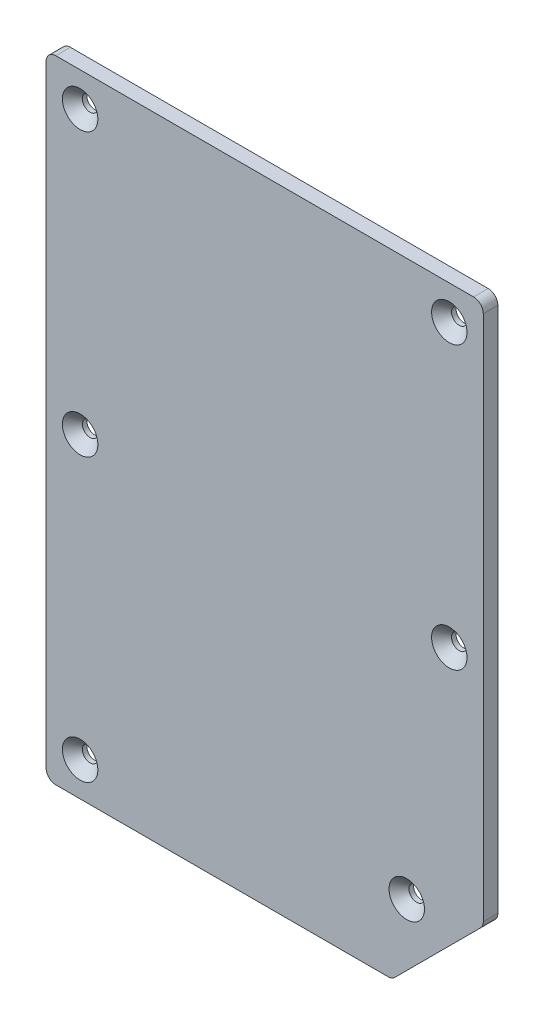
ISO-10303-21;
HEADER;
FILE_DESCRIPTION(('STEP AP214'),'2;1');
FILE_NAME('part.step','',(''),(''),'','','');
FILE_SCHEMA(('AUTOMOTIVE_DESIGN { 1 0 10303 214 1 1 1 1 }'));
ENDSEC;
DATA;
#1=APPLICATION_CONTEXT('core data for automotive mechanical design processes');
#2=APPLICATION_PROTOCOL_DEFINITION('international standard','automotive_design',2000,#1);
#3=PRODUCT_CONTEXT('',#1,'mechanical');
#4=PRODUCT('Part','Part','',(#3));
#5=PRODUCT_RELATED_PRODUCT_CATEGORY('part','',(#4));
#6=PRODUCT_DEFINITION_FORMATION('','',#4);
#7=PRODUCT_DEFINITION_CONTEXT('part definition',#1,'design');
#8=PRODUCT_DEFINITION('design','',#6,#7);
#9=PRODUCT_DEFINITION_SHAPE('','',#8);
#10=(LENGTH_UNIT() NAMED_UNIT(*) SI_UNIT(.MILLI.,.METRE.));
#11=(NAMED_UNIT(*) PLANE_ANGLE_UNIT() SI_UNIT($,.RADIAN.));
#12=(NAMED_UNIT(*) SI_UNIT($,.STERADIAN.) SOLID_ANGLE_UNIT());
#13=UNCERTAINTY_MEASURE_WITH_UNIT(LENGTH_MEASURE(1.E-05),#10,'distance_accuracy_value','');
#14=(GEOMETRIC_REPRESENTATION_CONTEXT(3) GLOBAL_UNCERTAINTY_ASSIGNED_CONTEXT((#13)) GLOBAL_UNIT_ASSIGNED_CONTEXT((#10,
#11,#12)) REPRESENTATION_CONTEXT('',''));
#15=CARTESIAN_POINT('',(0.,0.,0.));
#16=DIRECTION('',(0.,0.,1.));
#17=DIRECTION('',(1.,0.,0.));
#18=AXIS2_PLACEMENT_3D('',#15,#16,#17);
#19=CARTESIAN_POINT('',(43.,-40.3847763108502,3.));
#20=DIRECTION('',(0.,0.,-1.));
#21=DIRECTION('',(-1.,0.,0.));
#22=AXIS2_PLACEMENT_3D('',#19,#20,#21);
#23=CYLINDRICAL_SURFACE('',#22,2.00000000000002);
#24=CARTESIAN_POINT('',(43.,-40.3847763108502,0.));
#25=DIRECTION('',(0.,0.,1.));
#26=DIRECTION('',(-1.,0.,0.));
#27=AXIS2_PLACEMENT_3D('',#24,#25,#26);
#28=CIRCLE('',#27,2.00000000000002);
#29=CARTESIAN_POINT('',(44.4142135623731,-41.7989898732233,0.));
#30=VERTEX_POINT('',#29);
#31=CARTESIAN_POINT('',(45.,-40.3847763108502,0.));
#32=VERTEX_POINT('',#31);
#33=EDGE_CURVE('E143',#30,#32,#28,.T.);
#34=ORIENTED_EDGE('',*,*,#33,.T.);
#35=DIRECTION('',(0.,0.,-1.));
#36=VECTOR('',#35,1.);
#37=CARTESIAN_POINT('',(45.,-40.3847763108502,3.));
#38=LINE('',#37,#36);
#39=CARTESIAN_POINT('',(45.,-40.3847763108502,3.));
#40=VERTEX_POINT('',#39);
#41=EDGE_CURVE('E11',#40,#32,#38,.T.);
#42=ORIENTED_EDGE('',*,*,#41,.F.);
#43=CARTESIAN_POINT('',(43.,-40.3847763108502,3.));
#44=DIRECTION('',(0.,0.,1.));
#45=DIRECTION('',(-1.,0.,0.));
#46=AXIS2_PLACEMENT_3D('',#43,#44,#45);
#47=CIRCLE('',#46,2.00000000000002);
#48=CARTESIAN_POINT('',(44.4142135623731,-41.7989898732233,3.));
#49=VERTEX_POINT('',#48);
#50=EDGE_CURVE('E162',#49,#40,#47,.T.);
#51=ORIENTED_EDGE('',*,*,#50,.F.);
#52=DIRECTION('',(0.,0.,-1.));
#53=VECTOR('',#52,1.);
#54=CARTESIAN_POINT('',(44.4142135623731,-41.7989898732233,3.));
#55=LINE('',#54,#53);
#56=EDGE_CURVE('E139',#49,#30,#55,.T.);
#57=ORIENTED_EDGE('',*,*,#56,.T.);
#58=EDGE_LOOP('',(#34,#42,#51,#57));
#59=FACE_BOUND('',#58,.T.);
#60=ADVANCED_FACE('F33',(#59),#23,.T.);
#61=CARTESIAN_POINT('',(45.,68.,3.));
#62=DIRECTION('',(-1.,0.,0.));
#63=DIRECTION('',(0.,-1.,0.));
#64=AXIS2_PLACEMENT_3D('',#61,#62,#63);
#65=PLANE('',#64);
#66=DIRECTION('',(0.,1.,0.));
#67=VECTOR('',#66,1.);
#68=CARTESIAN_POINT('',(45.,68.,0.));
#69=LINE('',#68,#67);
#70=CARTESIAN_POINT('',(45.,68.,0.));
#71=VERTEX_POINT('',#70);
#72=EDGE_CURVE('E146',#32,#71,#69,.T.);
#73=ORIENTED_EDGE('',*,*,#72,.T.);
#74=DIRECTION('',(0.,0.,-1.));
#75=VECTOR('',#74,1.);
#76=CARTESIAN_POINT('',(45.,68.,3.));
#77=LINE('',#76,#75);
#78=CARTESIAN_POINT('',(45.,68.,3.));
#79=VERTEX_POINT('',#78);
#80=EDGE_CURVE('E42',#79,#71,#77,.T.);
#81=ORIENTED_EDGE('',*,*,#80,.F.);
#82=DIRECTION('',(0.,1.,0.));
#83=VECTOR('',#82,1.);
#84=CARTESIAN_POINT('',(45.,68.,3.));
#85=LINE('',#84,#83);
#86=EDGE_CURVE('E100',#40,#79,#85,.T.);
#87=ORIENTED_EDGE('',*,*,#86,.F.);
#88=ORIENTED_EDGE('',*,*,#41,.T.);
#89=EDGE_LOOP('',(#73,#81,#87,#88));
#90=FACE_BOUND('',#89,.T.);
#91=ADVANCED_FACE('F266',(#90),#65,.F.);
#92=CARTESIAN_POINT('',(43.,68.,3.));
#93=DIRECTION('',(0.,0.,-1.));
#94=DIRECTION('',(-1.,0.,0.));
#95=AXIS2_PLACEMENT_3D('',#92,#93,#94);
#96=CYLINDRICAL_SURFACE('',#95,2.);
#97=CARTESIAN_POINT('',(43.,68.,0.));
#98=DIRECTION('',(0.,0.,1.));
#99=DIRECTION('',(1.,0.,0.));
#100=AXIS2_PLACEMENT_3D('',#97,#98,#99);
#101=CIRCLE('',#100,2.);
#102=CARTESIAN_POINT('',(43.,70.,0.));
#103=VERTEX_POINT('',#102);
#104=EDGE_CURVE('E149',#71,#103,#101,.T.);
#105=ORIENTED_EDGE('',*,*,#104,.T.);
#106=DIRECTION('',(0.,0.,-1.));
#107=VECTOR('',#106,1.);
#108=CARTESIAN_POINT('',(43.,70.,3.));
#109=LINE('',#108,#107);
#110=CARTESIAN_POINT('',(43.,70.,3.));
#111=VERTEX_POINT('',#110);
#112=EDGE_CURVE('E175',#111,#103,#109,.T.);
#113=ORIENTED_EDGE('',*,*,#112,.F.);
#114=CARTESIAN_POINT('',(43.,68.,3.));
#115=DIRECTION('',(0.,0.,1.));
#116=DIRECTION('',(1.,0.,0.));
#117=AXIS2_PLACEMENT_3D('',#114,#115,#116);
#118=CIRCLE('',#117,2.);
#119=EDGE_CURVE('E230',#79,#111,#118,.T.);
#120=ORIENTED_EDGE('',*,*,#119,.F.);
#121=ORIENTED_EDGE('',*,*,#80,.T.);
#122=EDGE_LOOP('',(#105,#113,#120,#121));
#123=FACE_BOUND('',#122,.T.);
#124=ADVANCED_FACE('F270',(#123),#96,.T.);
#125=CARTESIAN_POINT('',(-43.,70.,3.));
#126=DIRECTION('',(0.,-1.,0.));
#127=DIRECTION('',(1.,0.,0.));
#128=AXIS2_PLACEMENT_3D('',#125,#126,#127);
#129=PLANE('',#128);
#130=DIRECTION('',(-1.,0.,0.));
#131=VECTOR('',#130,1.);
#132=CARTESIAN_POINT('',(-43.,70.,0.));
#133=LINE('',#132,#131);
#134=CARTESIAN_POINT('',(-43.,70.,0.));
#135=VERTEX_POINT('',#134);
#136=EDGE_CURVE('E151',#103,#135,#133,.T.);
#137=ORIENTED_EDGE('',*,*,#136,.T.);
#138=DIRECTION('',(0.,0.,-1.));
#139=VECTOR('',#138,1.);
#140=CARTESIAN_POINT('',(-43.,70.,3.));
#141=LINE('',#140,#139);
#142=CARTESIAN_POINT('',(-43.,70.,3.));
#143=VERTEX_POINT('',#142);
#144=EDGE_CURVE('E172',#143,#135,#141,.T.);
#145=ORIENTED_EDGE('',*,*,#144,.F.);
#146=DIRECTION('',(-1.,0.,0.));
#147=VECTOR('',#146,1.);
#148=CARTESIAN_POINT('',(-43.,70.,3.));
#149=LINE('',#148,#147);
#150=EDGE_CURVE('E232',#111,#143,#149,.T.);
#151=ORIENTED_EDGE('',*,*,#150,.F.);
#152=ORIENTED_EDGE('',*,*,#112,.T.);
#153=EDGE_LOOP('',(#137,#145,#151,#152));
#154=FACE_BOUND('',#153,.T.);
#155=ADVANCED_FACE('F274',(#154),#129,.F.);
#156=CARTESIAN_POINT('',(-43.,68.,3.));
#157=DIRECTION('',(0.,0.,-1.));
#158=DIRECTION('',(-1.,0.,0.));
#159=AXIS2_PLACEMENT_3D('',#156,#157,#158);
#160=CYLINDRICAL_SURFACE('',#159,2.00000000000002);
#161=CARTESIAN_POINT('',(-43.,68.,0.));
#162=DIRECTION('',(0.,0.,1.));
#163=DIRECTION('',(1.,0.,0.));
#164=AXIS2_PLACEMENT_3D('',#161,#162,#163);
#165=CIRCLE('',#164,2.00000000000002);
#166=CARTESIAN_POINT('',(-45.,68.,0.));
#167=VERTEX_POINT('',#166);
#168=EDGE_CURVE('E153',#135,#167,#165,.T.);
#169=ORIENTED_EDGE('',*,*,#168,.T.);
#170=DIRECTION('',(0.,0.,-1.));
#171=VECTOR('',#170,1.);
#172=CARTESIAN_POINT('',(-45.,68.,3.));
#173=LINE('',#172,#171);
#174=CARTESIAN_POINT('',(-45.,68.,3.));
#175=VERTEX_POINT('',#174);
#176=EDGE_CURVE('E169',#175,#167,#173,.T.);
#177=ORIENTED_EDGE('',*,*,#176,.F.);
#178=CARTESIAN_POINT('',(-43.,68.,3.));
#179=DIRECTION('',(0.,0.,1.));
#180=DIRECTION('',(1.,0.,0.));
#181=AXIS2_PLACEMENT_3D('',#178,#179,#180);
#182=CIRCLE('',#181,2.00000000000002);
#183=EDGE_CURVE('E234',#143,#175,#182,.T.);
#184=ORIENTED_EDGE('',*,*,#183,.F.);
#185=ORIENTED_EDGE('',*,*,#144,.T.);
#186=EDGE_LOOP('',(#169,#177,#184,#185));
#187=FACE_BOUND('',#186,.T.);
#188=ADVANCED_FACE('F280',(#187),#160,.T.);
#189=CARTESIAN_POINT('',(-45.,68.,3.));
#190=DIRECTION('',(1.,0.,0.));
#191=DIRECTION('',(0.,1.,0.));
#192=AXIS2_PLACEMENT_3D('',#189,#190,#191);
#193=PLANE('',#192);
#194=DIRECTION('',(0.,-1.,0.));
#195=VECTOR('',#194,1.);
#196=CARTESIAN_POINT('',(-45.,68.,0.));
#197=LINE('',#196,#195);
#198=CARTESIAN_POINT('',(-45.,-58.,0.));
#199=VERTEX_POINT('',#198);
#200=EDGE_CURVE('E155',#167,#199,#197,.T.);
#201=ORIENTED_EDGE('',*,*,#200,.T.);
#202=DIRECTION('',(0.,0.,-1.));
#203=VECTOR('',#202,1.);
#204=CARTESIAN_POINT('',(-45.,-58.,3.));
#205=LINE('',#204,#203);
#206=CARTESIAN_POINT('',(-45.,-58.,3.));
#207=VERTEX_POINT('',#206);
#208=EDGE_CURVE('E166',#207,#199,#205,.T.);
#209=ORIENTED_EDGE('',*,*,#208,.F.);
#210=DIRECTION('',(0.,-1.,0.));
#211=VECTOR('',#210,1.);
#212=CARTESIAN_POINT('',(-45.,68.,3.));
#213=LINE('',#212,#211);
#214=EDGE_CURVE('E236',#175,#207,#213,.T.);
#215=ORIENTED_EDGE('',*,*,#214,.F.);
#216=ORIENTED_EDGE('',*,*,#176,.T.);
#217=EDGE_LOOP('',(#201,#209,#215,#216));
#218=FACE_BOUND('',#217,.T.);
#219=ADVANCED_FACE('F242',(#218),#193,.F.);
#220=CARTESIAN_POINT('',(-43.,-58.,3.));
#221=DIRECTION('',(0.,0.,-1.));
#222=DIRECTION('',(-1.,0.,0.));
#223=AXIS2_PLACEMENT_3D('',#220,#221,#222);
#224=CYLINDRICAL_SURFACE('',#223,1.99999999999999);
#225=CARTESIAN_POINT('',(-43.,-58.,0.));
#226=DIRECTION('',(0.,0.,1.));
#227=DIRECTION('',(-1.,0.,0.));
#228=AXIS2_PLACEMENT_3D('',#225,#226,#227);
#229=CIRCLE('',#228,1.99999999999999);
#230=CARTESIAN_POINT('',(-43.,-60.,0.));
#231=VERTEX_POINT('',#230);
#232=EDGE_CURVE('E157',#199,#231,#229,.T.);
#233=ORIENTED_EDGE('',*,*,#232,.T.);
#234=DIRECTION('',(0.,0.,-1.));
#235=VECTOR('',#234,1.);
#236=CARTESIAN_POINT('',(-43.,-60.,3.));
#237=LINE('',#236,#235);
#238=CARTESIAN_POINT('',(-43.,-60.,3.));
#239=VERTEX_POINT('',#238);
#240=EDGE_CURVE('E134',#239,#231,#237,.T.);
#241=ORIENTED_EDGE('',*,*,#240,.F.);
#242=CARTESIAN_POINT('',(-43.,-58.,3.));
#243=DIRECTION('',(0.,0.,1.));
#244=DIRECTION('',(-1.,0.,0.));
#245=AXIS2_PLACEMENT_3D('',#242,#243,#244);
#246=CIRCLE('',#245,1.99999999999999);
#247=EDGE_CURVE('E125',#207,#239,#246,.T.);
#248=ORIENTED_EDGE('',*,*,#247,.F.);
#249=ORIENTED_EDGE('',*,*,#208,.T.);
#250=EDGE_LOOP('',(#233,#241,#248,#249));
#251=FACE_BOUND('',#250,.T.);
#252=ADVANCED_FACE('F246',(#251),#224,.T.);
#253=CARTESIAN_POINT('',(-43.,-60.,3.));
#254=DIRECTION('',(0.,1.,0.));
#255=DIRECTION('',(0.,0.,1.));
#256=AXIS2_PLACEMENT_3D('',#253,#254,#255);
#257=PLANE('',#256);
#258=DIRECTION('',(1.,0.,0.));
#259=VECTOR('',#258,1.);
#260=CARTESIAN_POINT('',(-43.,-60.,0.));
#261=LINE('',#260,#259);
#262=CARTESIAN_POINT('',(25.3847763108502,-60.,0.));
#263=VERTEX_POINT('',#262);
#264=EDGE_CURVE('E133',#231,#263,#261,.T.);
#265=ORIENTED_EDGE('',*,*,#264,.T.);
#266=DIRECTION('',(0.,0.,-1.));
#267=VECTOR('',#266,1.);
#268=CARTESIAN_POINT('',(25.3847763108502,-60.,3.));
#269=LINE('',#268,#267);
#270=CARTESIAN_POINT('',(25.3847763108502,-60.,3.));
#271=VERTEX_POINT('',#270);
#272=EDGE_CURVE('E130',#271,#263,#269,.T.);
#273=ORIENTED_EDGE('',*,*,#272,.F.);
#274=DIRECTION('',(1.,0.,0.));
#275=VECTOR('',#274,1.);
#276=CARTESIAN_POINT('',(-43.,-60.,3.));
#277=LINE('',#276,#275);
#278=EDGE_CURVE('E119',#239,#271,#277,.T.);
#279=ORIENTED_EDGE('',*,*,#278,.F.);
#280=ORIENTED_EDGE('',*,*,#240,.T.);
#281=EDGE_LOOP('',(#265,#273,#279,#280));
#282=FACE_BOUND('',#281,.T.);
#283=ADVANCED_FACE('F131',(#282),#257,.F.);
#284=CARTESIAN_POINT('',(25.3847763108502,-58.,3.));
#285=DIRECTION('',(0.,0.,-1.));
#286=DIRECTION('',(-1.,0.,0.));
#287=AXIS2_PLACEMENT_3D('',#284,#285,#286);
#288=CYLINDRICAL_SURFACE('',#287,1.99999999999999);
#289=CARTESIAN_POINT('',(25.3847763108502,-58.,0.));
#290=DIRECTION('',(0.,0.,1.));
#291=DIRECTION('',(-1.,0.,0.));
#292=AXIS2_PLACEMENT_3D('',#289,#290,#291);
#293=CIRCLE('',#292,1.99999999999999);
#294=CARTESIAN_POINT('',(26.7989898732233,-59.4142135623731,0.));
#295=VERTEX_POINT('',#294);
#296=EDGE_CURVE('E86',#263,#295,#293,.T.);
#297=ORIENTED_EDGE('',*,*,#296,.T.);
#298=DIRECTION('',(0.,0.,-1.));
#299=VECTOR('',#298,1.);
#300=CARTESIAN_POINT('',(26.7989898732233,-59.4142135623731,3.));
#301=LINE('',#300,#299);
#302=CARTESIAN_POINT('',(26.7989898732233,-59.4142135623731,3.));
#303=VERTEX_POINT('',#302);
#304=EDGE_CURVE('E135',#303,#295,#301,.T.);
#305=ORIENTED_EDGE('',*,*,#304,.F.);
#306=CARTESIAN_POINT('',(25.3847763108502,-58.,3.));
#307=DIRECTION('',(0.,0.,1.));
#308=DIRECTION('',(-1.,0.,0.));
#309=AXIS2_PLACEMENT_3D('',#306,#307,#308);
#310=CIRCLE('',#309,1.99999999999999);
#311=EDGE_CURVE('E123',#271,#303,#310,.T.);
#312=ORIENTED_EDGE('',*,*,#311,.F.);
#313=ORIENTED_EDGE('',*,*,#272,.T.);
#314=EDGE_LOOP('',(#297,#305,#312,#313));
#315=FACE_BOUND('',#314,.T.);
#316=ADVANCED_FACE('F137',(#315),#288,.T.);
#317=CARTESIAN_POINT('',(44.4142135623731,-41.7989898732233,3.));
#318=DIRECTION('',(-0.707106781186547,0.707106781186548,0.));
#319=DIRECTION('',(-0.707106781186548,-0.707106781186547,0.));
#320=AXIS2_PLACEMENT_3D('',#317,#318,#319);
#321=PLANE('',#320);
#322=DIRECTION('',(0.707106781186548,0.707106781186547,0.));
#323=VECTOR('',#322,1.);
#324=CARTESIAN_POINT('',(44.4142135623731,-41.7989898732233,0.));
#325=LINE('',#324,#323);
#326=EDGE_CURVE('E92',#295,#30,#325,.T.);
#327=ORIENTED_EDGE('',*,*,#326,.T.);
#328=ORIENTED_EDGE('',*,*,#56,.F.);
#329=DIRECTION('',(0.707106781186548,0.707106781186547,0.));
#330=VECTOR('',#329,1.);
#331=CARTESIAN_POINT('',(44.4142135623731,-41.7989898732233,3.));
#332=LINE('',#331,#330);
#333=EDGE_CURVE('E51',#303,#49,#332,.T.);
#334=ORIENTED_EDGE('',*,*,#333,.F.);
#335=ORIENTED_EDGE('',*,*,#304,.T.);
#336=EDGE_LOOP('',(#327,#328,#334,#335));
#337=FACE_BOUND('',#336,.T.);
#338=ADVANCED_FACE('F254',(#337),#321,.F.);
#339=CARTESIAN_POINT('',(43.,-40.3847763108502,3.));
#340=DIRECTION('',(0.,0.,-1.));
#341=DIRECTION('',(-1.,0.,0.));
#342=AXIS2_PLACEMENT_3D('',#339,#340,#341);
#343=PLANE('',#342);
#344=CARTESIAN_POINT('',(-38.,-53.,3.));
#345=DIRECTION('',(0.,0.,1.));
#346=DIRECTION('',(1.,0.,0.));
#347=AXIS2_PLACEMENT_3D('',#344,#345,#346);
#348=CIRCLE('',#347,3.65);
#349=CARTESIAN_POINT('',(-34.35,-53.,3.));
#350=VERTEX_POINT('',#349);
#351=EDGE_CURVE('E445',#350,#350,#348,.T.);
#352=ORIENTED_EDGE('',*,*,#351,.F.);
#353=EDGE_LOOP('',(#352));
#354=FACE_BOUND('',#353,.T.);
#355=CARTESIAN_POINT('',(29.2426406871192,-44.2426406871192,3.));
#356=DIRECTION('',(0.,0.,1.));
#357=DIRECTION('',(1.,0.,0.));
#358=AXIS2_PLACEMENT_3D('',#355,#356,#357);
#359=CIRCLE('',#358,3.65);
#360=CARTESIAN_POINT('',(32.8926406871192,-44.2426406871192,3.));
#361=VERTEX_POINT('',#360);
#362=EDGE_CURVE('E206',#361,#361,#359,.T.);
#363=ORIENTED_EDGE('',*,*,#362,.F.);
#364=EDGE_LOOP('',(#363));
#365=FACE_BOUND('',#364,.T.);
#366=CARTESIAN_POINT('',(38.,5.00000000000001,3.));
#367=DIRECTION('',(0.,0.,1.));
#368=DIRECTION('',(1.,0.,0.));
#369=AXIS2_PLACEMENT_3D('',#366,#367,#368);
#370=CIRCLE('',#369,3.65);
#371=CARTESIAN_POINT('',(41.65,5.00000000000001,3.));
#372=VERTEX_POINT('',#371);
#373=EDGE_CURVE('E199',#372,#372,#370,.T.);
#374=ORIENTED_EDGE('',*,*,#373,.F.);
#375=EDGE_LOOP('',(#374));
#376=FACE_BOUND('',#375,.T.);
#377=CARTESIAN_POINT('',(-38.,5.00000000000001,3.));
#378=DIRECTION('',(0.,0.,1.));
#379=DIRECTION('',(1.,0.,0.));
#380=AXIS2_PLACEMENT_3D('',#377,#378,#379);
#381=CIRCLE('',#380,3.65);
#382=CARTESIAN_POINT('',(-34.35,5.00000000000001,3.));
#383=VERTEX_POINT('',#382);
#384=EDGE_CURVE('E195',#383,#383,#381,.T.);
#385=ORIENTED_EDGE('',*,*,#384,.F.);
#386=EDGE_LOOP('',(#385));
#387=FACE_BOUND('',#386,.T.);
#388=CARTESIAN_POINT('',(-38.,63.,3.));
#389=DIRECTION('',(0.,0.,1.));
#390=DIRECTION('',(1.,0.,0.));
#391=AXIS2_PLACEMENT_3D('',#388,#389,#390);
#392=CIRCLE('',#391,3.65);
#393=CARTESIAN_POINT('',(-34.35,63.,3.));
#394=VERTEX_POINT('',#393);
#395=EDGE_CURVE('E191',#394,#394,#392,.T.);
#396=ORIENTED_EDGE('',*,*,#395,.F.);
#397=EDGE_LOOP('',(#396));
#398=FACE_BOUND('',#397,.T.);
#399=CARTESIAN_POINT('',(38.,63.,3.));
#400=DIRECTION('',(0.,0.,1.));
#401=DIRECTION('',(1.,0.,0.));
#402=AXIS2_PLACEMENT_3D('',#399,#400,#401);
#403=CIRCLE('',#402,3.65);
#404=CARTESIAN_POINT('',(41.65,63.,3.));
#405=VERTEX_POINT('',#404);
#406=EDGE_CURVE('E186',#405,#405,#403,.T.);
#407=ORIENTED_EDGE('',*,*,#406,.F.);
#408=EDGE_LOOP('',(#407));
#409=FACE_BOUND('',#408,.T.);
#410=ORIENTED_EDGE('',*,*,#50,.T.);
#411=ORIENTED_EDGE('',*,*,#86,.T.);
#412=ORIENTED_EDGE('',*,*,#119,.T.);
#413=ORIENTED_EDGE('',*,*,#150,.T.);
#414=ORIENTED_EDGE('',*,*,#183,.T.);
#415=ORIENTED_EDGE('',*,*,#214,.T.);
#416=ORIENTED_EDGE('',*,*,#247,.T.);
#417=ORIENTED_EDGE('',*,*,#278,.T.);
#418=ORIENTED_EDGE('',*,*,#311,.T.);
#419=ORIENTED_EDGE('',*,*,#333,.T.);
#420=EDGE_LOOP('',(#410,#411,#412,#413,#414,#415,#416,#417,#418,#419));
#421=FACE_BOUND('',#420,.T.);
#422=ADVANCED_FACE('F121',(#354,#365,#376,#387,#398,#409,#421),#343,.F.);
#423=CARTESIAN_POINT('',(43.,-40.3847763108502,0.));
#424=DIRECTION('',(0.,0.,-1.));
#425=DIRECTION('',(-1.,0.,0.));
#426=AXIS2_PLACEMENT_3D('',#423,#424,#425);
#427=PLANE('',#426);
#428=CARTESIAN_POINT('',(-38.,-53.,0.));
#429=DIRECTION('',(0.,0.,-1.));
#430=DIRECTION('',(-1.,0.,0.));
#431=AXIS2_PLACEMENT_3D('',#428,#429,#430);
#432=CIRCLE('',#431,1.59999999999999);
#433=CARTESIAN_POINT('',(-39.6,-53.,0.));
#434=VERTEX_POINT('',#433);
#435=EDGE_CURVE('E36',#434,#434,#432,.T.);
#436=ORIENTED_EDGE('',*,*,#435,.F.);
#437=EDGE_LOOP('',(#436));
#438=FACE_BOUND('',#437,.T.);
#439=CARTESIAN_POINT('',(29.2426406871192,-44.2426406871192,0.));
#440=DIRECTION('',(0.,0.,-1.));
#441=DIRECTION('',(-1.,0.,0.));
#442=AXIS2_PLACEMENT_3D('',#439,#440,#441);
#443=CIRCLE('',#442,1.59999999999999);
#444=CARTESIAN_POINT('',(27.6426406871192,-44.2426406871192,0.));
#445=VERTEX_POINT('',#444);
#446=EDGE_CURVE('E197',#445,#445,#443,.T.);
#447=ORIENTED_EDGE('',*,*,#446,.F.);
#448=EDGE_LOOP('',(#447));
#449=FACE_BOUND('',#448,.T.);
#450=CARTESIAN_POINT('',(38.,5.00000000000001,0.));
#451=DIRECTION('',(0.,0.,-1.));
#452=DIRECTION('',(-1.,0.,0.));
#453=AXIS2_PLACEMENT_3D('',#450,#451,#452);
#454=CIRCLE('',#453,1.59999999999999);
#455=CARTESIAN_POINT('',(36.4,5.00000000000001,0.));
#456=VERTEX_POINT('',#455);
#457=EDGE_CURVE('E193',#456,#456,#454,.T.);
#458=ORIENTED_EDGE('',*,*,#457,.F.);
#459=EDGE_LOOP('',(#458));
#460=FACE_BOUND('',#459,.T.);
#461=CARTESIAN_POINT('',(-38.,5.00000000000001,0.));
#462=DIRECTION('',(0.,0.,-1.));
#463=DIRECTION('',(-1.,0.,0.));
#464=AXIS2_PLACEMENT_3D('',#461,#462,#463);
#465=CIRCLE('',#464,1.59999999999999);
#466=CARTESIAN_POINT('',(-39.6,5.00000000000001,0.));
#467=VERTEX_POINT('',#466);
#468=EDGE_CURVE('E188',#467,#467,#465,.T.);
#469=ORIENTED_EDGE('',*,*,#468,.F.);
#470=EDGE_LOOP('',(#469));
#471=FACE_BOUND('',#470,.T.);
#472=CARTESIAN_POINT('',(-38.,63.,0.));
#473=DIRECTION('',(0.,0.,-1.));
#474=DIRECTION('',(-1.,0.,0.));
#475=AXIS2_PLACEMENT_3D('',#472,#473,#474);
#476=CIRCLE('',#475,1.59999999999999);
#477=CARTESIAN_POINT('',(-39.6,63.,0.));
#478=VERTEX_POINT('',#477);
#479=EDGE_CURVE('E183',#478,#478,#476,.T.);
#480=ORIENTED_EDGE('',*,*,#479,.F.);
#481=EDGE_LOOP('',(#480));
#482=FACE_BOUND('',#481,.T.);
#483=CARTESIAN_POINT('',(38.,63.,0.));
#484=DIRECTION('',(0.,0.,-1.));
#485=DIRECTION('',(-1.,0.,0.));
#486=AXIS2_PLACEMENT_3D('',#483,#484,#485);
#487=CIRCLE('',#486,1.59999999999999);
#488=CARTESIAN_POINT('',(36.4,63.,0.));
#489=VERTEX_POINT('',#488);
#490=EDGE_CURVE('E147',#489,#489,#487,.T.);
#491=ORIENTED_EDGE('',*,*,#490,.F.);
#492=EDGE_LOOP('',(#491));
#493=FACE_BOUND('',#492,.T.);
#494=ORIENTED_EDGE('',*,*,#33,.F.);
#495=ORIENTED_EDGE('',*,*,#326,.F.);
#496=ORIENTED_EDGE('',*,*,#296,.F.);
#497=ORIENTED_EDGE('',*,*,#264,.F.);
#498=ORIENTED_EDGE('',*,*,#232,.F.);
#499=ORIENTED_EDGE('',*,*,#200,.F.);
#500=ORIENTED_EDGE('',*,*,#168,.F.);
#501=ORIENTED_EDGE('',*,*,#136,.F.);
#502=ORIENTED_EDGE('',*,*,#104,.F.);
#503=ORIENTED_EDGE('',*,*,#72,.F.);
#504=EDGE_LOOP('',(#494,#495,#496,#497,#498,#499,#500,#501,#502,#503));
#505=FACE_BOUND('',#504,.T.);
#506=ADVANCED_FACE('F249',(#438,#449,#460,#471,#482,#493,#505),#427,.T.);
#507=CARTESIAN_POINT('',(38.,63.,3.));
#508=DIRECTION('',(0.,0.,1.));
#509=DIRECTION('',(1.,0.,0.));
#510=AXIS2_PLACEMENT_3D('',#507,#508,#509);
#511=CYLINDRICAL_SURFACE('',#510,1.59999999999999);
#512=ORIENTED_EDGE('',*,*,#490,.T.);
#513=EDGE_LOOP('',(#512));
#514=FACE_BOUND('',#513,.T.);
#515=CARTESIAN_POINT('',(38.,63.,0.95));
#516=DIRECTION('',(0.,0.,1.));
#517=DIRECTION('',(1.,0.,0.));
#518=AXIS2_PLACEMENT_3D('',#515,#516,#517);
#519=CIRCLE('',#518,1.6);
#520=CARTESIAN_POINT('',(39.6,63.,0.95));
#521=VERTEX_POINT('',#520);
#522=EDGE_CURVE('E182',#521,#521,#519,.T.);
#523=ORIENTED_EDGE('',*,*,#522,.T.);
#524=EDGE_LOOP('',(#523));
#525=FACE_BOUND('',#524,.T.);
#526=ADVANCED_FACE('F317',(#514,#525),#511,.F.);
#527=CARTESIAN_POINT('',(38.,63.,3.));
#528=DIRECTION('',(0.,0.,1.));
#529=DIRECTION('',(1.,0.,0.));
#530=AXIS2_PLACEMENT_3D('',#527,#528,#529);
#531=CONICAL_SURFACE('',#530,3.65,0.785398163397449);
#532=ORIENTED_EDGE('',*,*,#522,.F.);
#533=EDGE_LOOP('',(#532));
#534=FACE_BOUND('',#533,.T.);
#535=ORIENTED_EDGE('',*,*,#406,.T.);
#536=EDGE_LOOP('',(#535));
#537=FACE_BOUND('',#536,.T.);
#538=ADVANCED_FACE('F326',(#534,#537),#531,.F.);
#539=CARTESIAN_POINT('',(-38.,63.,3.));
#540=DIRECTION('',(0.,0.,1.));
#541=DIRECTION('',(1.,0.,0.));
#542=AXIS2_PLACEMENT_3D('',#539,#540,#541);
#543=CYLINDRICAL_SURFACE('',#542,1.59999999999999);
#544=ORIENTED_EDGE('',*,*,#479,.T.);
#545=EDGE_LOOP('',(#544));
#546=FACE_BOUND('',#545,.T.);
#547=CARTESIAN_POINT('',(-38.,63.,0.95));
#548=DIRECTION('',(0.,0.,1.));
#549=DIRECTION('',(1.,0.,0.));
#550=AXIS2_PLACEMENT_3D('',#547,#548,#549);
#551=CIRCLE('',#550,1.6);
#552=CARTESIAN_POINT('',(-36.4,63.,0.95));
#553=VERTEX_POINT('',#552);
#554=EDGE_CURVE('E187',#553,#553,#551,.T.);
#555=ORIENTED_EDGE('',*,*,#554,.T.);
#556=EDGE_LOOP('',(#555));
#557=FACE_BOUND('',#556,.T.);
#558=ADVANCED_FACE('F336',(#546,#557),#543,.F.);
#559=CARTESIAN_POINT('',(-38.,63.,3.));
#560=DIRECTION('',(0.,0.,1.));
#561=DIRECTION('',(1.,0.,0.));
#562=AXIS2_PLACEMENT_3D('',#559,#560,#561);
#563=CONICAL_SURFACE('',#562,3.65,0.785398163397449);
#564=ORIENTED_EDGE('',*,*,#554,.F.);
#565=EDGE_LOOP('',(#564));
#566=FACE_BOUND('',#565,.T.);
#567=ORIENTED_EDGE('',*,*,#395,.T.);
#568=EDGE_LOOP('',(#567));
#569=FACE_BOUND('',#568,.T.);
#570=ADVANCED_FACE('F346',(#566,#569),#563,.F.);
#571=CARTESIAN_POINT('',(-38.,5.00000000000001,3.));
#572=DIRECTION('',(0.,0.,1.));
#573=DIRECTION('',(1.,0.,0.));
#574=AXIS2_PLACEMENT_3D('',#571,#572,#573);
#575=CYLINDRICAL_SURFACE('',#574,1.59999999999999);
#576=ORIENTED_EDGE('',*,*,#468,.T.);
#577=EDGE_LOOP('',(#576));
#578=FACE_BOUND('',#577,.T.);
#579=CARTESIAN_POINT('',(-38.,5.00000000000001,0.95));
#580=DIRECTION('',(0.,0.,1.));
#581=DIRECTION('',(1.,0.,0.));
#582=AXIS2_PLACEMENT_3D('',#579,#580,#581);
#583=CIRCLE('',#582,1.6);
#584=CARTESIAN_POINT('',(-36.4,5.00000000000001,0.95));
#585=VERTEX_POINT('',#584);
#586=EDGE_CURVE('E192',#585,#585,#583,.T.);
#587=ORIENTED_EDGE('',*,*,#586,.T.);
#588=EDGE_LOOP('',(#587));
#589=FACE_BOUND('',#588,.T.);
#590=ADVANCED_FACE('F356',(#578,#589),#575,.F.);
#591=CARTESIAN_POINT('',(-38.,5.00000000000001,3.));
#592=DIRECTION('',(0.,0.,1.));
#593=DIRECTION('',(1.,0.,0.));
#594=AXIS2_PLACEMENT_3D('',#591,#592,#593);
#595=CONICAL_SURFACE('',#594,3.65,0.785398163397449);
#596=ORIENTED_EDGE('',*,*,#586,.F.);
#597=EDGE_LOOP('',(#596));
#598=FACE_BOUND('',#597,.T.);
#599=ORIENTED_EDGE('',*,*,#384,.T.);
#600=EDGE_LOOP('',(#599));
#601=FACE_BOUND('',#600,.T.);
#602=ADVANCED_FACE('F366',(#598,#601),#595,.F.);
#603=CARTESIAN_POINT('',(38.,5.00000000000001,3.));
#604=DIRECTION('',(0.,0.,1.));
#605=DIRECTION('',(1.,0.,0.));
#606=AXIS2_PLACEMENT_3D('',#603,#604,#605);
#607=CYLINDRICAL_SURFACE('',#606,1.59999999999999);
#608=ORIENTED_EDGE('',*,*,#457,.T.);
#609=EDGE_LOOP('',(#608));
#610=FACE_BOUND('',#609,.T.);
#611=CARTESIAN_POINT('',(38.,5.00000000000001,0.95));
#612=DIRECTION('',(0.,0.,1.));
#613=DIRECTION('',(1.,0.,0.));
#614=AXIS2_PLACEMENT_3D('',#611,#612,#613);
#615=CIRCLE('',#614,1.6);
#616=CARTESIAN_POINT('',(39.6,5.00000000000001,0.95));
#617=VERTEX_POINT('',#616);
#618=EDGE_CURVE('E196',#617,#617,#615,.T.);
#619=ORIENTED_EDGE('',*,*,#618,.T.);
#620=EDGE_LOOP('',(#619));
#621=FACE_BOUND('',#620,.T.);
#622=ADVANCED_FACE('F376',(#610,#621),#607,.F.);
#623=CARTESIAN_POINT('',(38.,5.00000000000001,3.));
#624=DIRECTION('',(0.,0.,1.));
#625=DIRECTION('',(1.,0.,0.));
#626=AXIS2_PLACEMENT_3D('',#623,#624,#625);
#627=CONICAL_SURFACE('',#626,3.65,0.785398163397449);
#628=ORIENTED_EDGE('',*,*,#618,.F.);
#629=EDGE_LOOP('',(#628));
#630=FACE_BOUND('',#629,.T.);
#631=ORIENTED_EDGE('',*,*,#373,.T.);
#632=EDGE_LOOP('',(#631));
#633=FACE_BOUND('',#632,.T.);
#634=ADVANCED_FACE('F386',(#630,#633),#627,.F.);
#635=CARTESIAN_POINT('',(29.2426406871192,-44.2426406871192,3.));
#636=DIRECTION('',(0.,0.,1.));
#637=DIRECTION('',(1.,0.,0.));
#638=AXIS2_PLACEMENT_3D('',#635,#636,#637);
#639=CYLINDRICAL_SURFACE('',#638,1.59999999999999);
#640=ORIENTED_EDGE('',*,*,#446,.T.);
#641=EDGE_LOOP('',(#640));
#642=FACE_BOUND('',#641,.T.);
#643=CARTESIAN_POINT('',(29.2426406871192,-44.2426406871192,0.95));
#644=DIRECTION('',(0.,0.,1.));
#645=DIRECTION('',(1.,0.,0.));
#646=AXIS2_PLACEMENT_3D('',#643,#644,#645);
#647=CIRCLE('',#646,1.6);
#648=CARTESIAN_POINT('',(30.8426406871192,-44.2426406871192,0.95));
#649=VERTEX_POINT('',#648);
#650=EDGE_CURVE('E200',#649,#649,#647,.T.);
#651=ORIENTED_EDGE('',*,*,#650,.T.);
#652=EDGE_LOOP('',(#651));
#653=FACE_BOUND('',#652,.T.);
#654=ADVANCED_FACE('F396',(#642,#653),#639,.F.);
#655=CARTESIAN_POINT('',(29.2426406871192,-44.2426406871192,3.));
#656=DIRECTION('',(0.,0.,1.));
#657=DIRECTION('',(1.,0.,0.));
#658=AXIS2_PLACEMENT_3D('',#655,#656,#657);
#659=CONICAL_SURFACE('',#658,3.65,0.785398163397448);
#660=ORIENTED_EDGE('',*,*,#650,.F.);
#661=EDGE_LOOP('',(#660));
#662=FACE_BOUND('',#661,.T.);
#663=ORIENTED_EDGE('',*,*,#362,.T.);
#664=EDGE_LOOP('',(#663));
#665=FACE_BOUND('',#664,.T.);
#666=ADVANCED_FACE('F406',(#662,#665),#659,.F.);
#667=CARTESIAN_POINT('',(-38.,-53.,3.));
#668=DIRECTION('',(0.,0.,1.));
#669=DIRECTION('',(1.,0.,0.));
#670=AXIS2_PLACEMENT_3D('',#667,#668,#669);
#671=CYLINDRICAL_SURFACE('',#670,1.59999999999999);
#672=ORIENTED_EDGE('',*,*,#435,.T.);
#673=EDGE_LOOP('',(#672));
#674=FACE_BOUND('',#673,.T.);
#675=CARTESIAN_POINT('',(-38.,-53.,0.95));
#676=DIRECTION('',(0.,0.,1.));
#677=DIRECTION('',(1.,0.,0.));
#678=AXIS2_PLACEMENT_3D('',#675,#676,#677);
#679=CIRCLE('',#678,1.6);
#680=CARTESIAN_POINT('',(-36.4,-53.,0.95));
#681=VERTEX_POINT('',#680);
#682=EDGE_CURVE('E442',#681,#681,#679,.T.);
#683=ORIENTED_EDGE('',*,*,#682,.T.);
#684=EDGE_LOOP('',(#683));
#685=FACE_BOUND('',#684,.T.);
#686=ADVANCED_FACE('F415',(#674,#685),#671,.F.);
#687=CARTESIAN_POINT('',(-38.,-53.,3.));
#688=DIRECTION('',(0.,0.,1.));
#689=DIRECTION('',(1.,0.,0.));
#690=AXIS2_PLACEMENT_3D('',#687,#688,#689);
#691=CONICAL_SURFACE('',#690,3.65,0.785398163397449);
#692=ORIENTED_EDGE('',*,*,#682,.F.);
#693=EDGE_LOOP('',(#692));
#694=FACE_BOUND('',#693,.T.);
#695=ORIENTED_EDGE('',*,*,#351,.T.);
#696=EDGE_LOOP('',(#695));
#697=FACE_BOUND('',#696,.T.);
#698=ADVANCED_FACE('F425',(#694,#697),#691,.F.);
#699=CLOSED_SHELL('',(#60,#91,#124,#155,#188,#219,#252,#283,#316,#338,#422,#506,#526,#538,#558,
#570,#590,#602,#622,#634,#654,#666,#686,#698));
#700=MANIFOLD_SOLID_BREP('B2',#699);
#701=ADVANCED_BREP_SHAPE_REPRESENTATION('',(#18,#700),#14);
#702=SHAPE_DEFINITION_REPRESENTATION(#9,#701);
ENDSEC;
END-ISO-10303-21;
